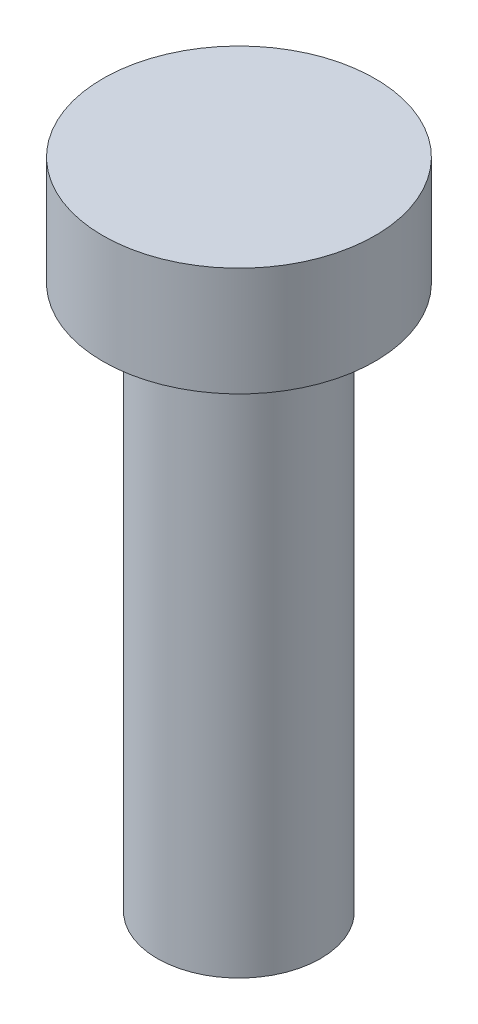
ISO-10303-21;
HEADER;
FILE_DESCRIPTION(('STEP AP214'),'2;1');
FILE_NAME('part.step','',(''),(''),'','','');
FILE_SCHEMA(('AUTOMOTIVE_DESIGN { 1 0 10303 214 1 1 1 1 }'));
ENDSEC;
DATA;
#1=APPLICATION_CONTEXT('core data for automotive mechanical design processes');
#2=APPLICATION_PROTOCOL_DEFINITION('international standard','automotive_design',2000,#1);
#3=PRODUCT_CONTEXT('',#1,'mechanical');
#4=PRODUCT('Part','Part','',(#3));
#5=PRODUCT_RELATED_PRODUCT_CATEGORY('part','',(#4));
#6=PRODUCT_DEFINITION_FORMATION('','',#4);
#7=PRODUCT_DEFINITION_CONTEXT('part definition',#1,'design');
#8=PRODUCT_DEFINITION('design','',#6,#7);
#9=PRODUCT_DEFINITION_SHAPE('','',#8);
#10=(LENGTH_UNIT() NAMED_UNIT(*) SI_UNIT(.MILLI.,.METRE.));
#11=(NAMED_UNIT(*) PLANE_ANGLE_UNIT() SI_UNIT($,.RADIAN.));
#12=(NAMED_UNIT(*) SI_UNIT($,.STERADIAN.) SOLID_ANGLE_UNIT());
#13=UNCERTAINTY_MEASURE_WITH_UNIT(LENGTH_MEASURE(1.E-05),#10,'distance_accuracy_value','');
#14=(GEOMETRIC_REPRESENTATION_CONTEXT(3) GLOBAL_UNCERTAINTY_ASSIGNED_CONTEXT((#13)) GLOBAL_UNIT_ASSIGNED_CONTEXT((#10,
#11,#12)) REPRESENTATION_CONTEXT('',''));
#15=CARTESIAN_POINT('',(0.,0.,0.));
#16=DIRECTION('',(0.,0.,1.));
#17=DIRECTION('',(1.,0.,0.));
#18=AXIS2_PLACEMENT_3D('',#15,#16,#17);
#19=CARTESIAN_POINT('',(0.,2.,0.));
#20=DIRECTION('',(0.,-1.,0.));
#21=DIRECTION('',(0.,0.,-1.));
#22=AXIS2_PLACEMENT_3D('',#19,#20,#21);
#23=CYLINDRICAL_SURFACE('',#22,2.5);
#24=CARTESIAN_POINT('',(0.,2.,0.));
#25=DIRECTION('',(0.,1.,0.));
#26=DIRECTION('',(0.,0.,1.));
#27=AXIS2_PLACEMENT_3D('',#24,#25,#26);
#28=CIRCLE('',#27,2.5);
#29=CARTESIAN_POINT('',(0.,2.,2.5));
#30=VERTEX_POINT('',#29);
#31=EDGE_CURVE('E10',#30,#30,#28,.T.);
#32=ORIENTED_EDGE('',*,*,#31,.F.);
#33=EDGE_LOOP('',(#32));
#34=FACE_BOUND('',#33,.T.);
#35=CARTESIAN_POINT('',(0.,0.,0.));
#36=DIRECTION('',(0.,1.,0.));
#37=DIRECTION('',(0.,0.,1.));
#38=AXIS2_PLACEMENT_3D('',#35,#36,#37);
#39=CIRCLE('',#38,2.5);
#40=CARTESIAN_POINT('',(0.,0.,2.5));
#41=VERTEX_POINT('',#40);
#42=EDGE_CURVE('E37',#41,#41,#39,.T.);
#43=ORIENTED_EDGE('',*,*,#42,.T.);
#44=EDGE_LOOP('',(#43));
#45=FACE_BOUND('',#44,.T.);
#46=ADVANCED_FACE('F34',(#34,#45),#23,.T.);
#47=CARTESIAN_POINT('',(0.,2.,0.));
#48=DIRECTION('',(0.,1.,0.));
#49=DIRECTION('',(0.,0.,1.));
#50=AXIS2_PLACEMENT_3D('',#47,#48,#49);
#51=PLANE('',#50);
#52=ORIENTED_EDGE('',*,*,#31,.T.);
#53=EDGE_LOOP('',(#52));
#54=FACE_BOUND('',#53,.T.);
#55=ADVANCED_FACE('F64',(#54),#51,.T.);
#56=CARTESIAN_POINT('',(0.,0.,0.));
#57=DIRECTION('',(0.,1.,0.));
#58=DIRECTION('',(0.,0.,1.));
#59=AXIS2_PLACEMENT_3D('',#56,#57,#58);
#60=PLANE('',#59);
#61=CARTESIAN_POINT('',(0.,0.,0.));
#62=DIRECTION('',(0.,1.,0.));
#63=DIRECTION('',(0.,0.,1.));
#64=AXIS2_PLACEMENT_3D('',#61,#62,#63);
#65=CIRCLE('',#64,1.5);
#66=CARTESIAN_POINT('',(0.,0.,1.5));
#67=VERTEX_POINT('',#66);
#68=EDGE_CURVE('E46',#67,#67,#65,.T.);
#69=ORIENTED_EDGE('',*,*,#68,.T.);
#70=EDGE_LOOP('',(#69));
#71=FACE_BOUND('',#70,.T.);
#72=ORIENTED_EDGE('',*,*,#42,.F.);
#73=EDGE_LOOP('',(#72));
#74=FACE_BOUND('',#73,.T.);
#75=ADVANCED_FACE('F61',(#71,#74),#60,.F.);
#76=CARTESIAN_POINT('',(0.,-10.,0.));
#77=DIRECTION('',(0.,1.,0.));
#78=DIRECTION('',(0.,0.,1.));
#79=AXIS2_PLACEMENT_3D('',#76,#77,#78);
#80=CYLINDRICAL_SURFACE('',#79,1.5);
#81=CARTESIAN_POINT('',(0.,-10.,0.));
#82=DIRECTION('',(0.,1.,0.));
#83=DIRECTION('',(0.,0.,1.));
#84=AXIS2_PLACEMENT_3D('',#81,#82,#83);
#85=CIRCLE('',#84,1.5);
#86=CARTESIAN_POINT('',(0.,-10.,1.5));
#87=VERTEX_POINT('',#86);
#88=EDGE_CURVE('E44',#87,#87,#85,.T.);
#89=ORIENTED_EDGE('',*,*,#88,.T.);
#90=EDGE_LOOP('',(#89));
#91=FACE_BOUND('',#90,.T.);
#92=ORIENTED_EDGE('',*,*,#68,.F.);
#93=EDGE_LOOP('',(#92));
#94=FACE_BOUND('',#93,.T.);
#95=ADVANCED_FACE('F52',(#91,#94),#80,.T.);
#96=CARTESIAN_POINT('',(0.,-10.,0.));
#97=DIRECTION('',(0.,1.,0.));
#98=DIRECTION('',(0.,0.,1.));
#99=AXIS2_PLACEMENT_3D('',#96,#97,#98);
#100=PLANE('',#99);
#101=ORIENTED_EDGE('',*,*,#88,.F.);
#102=EDGE_LOOP('',(#101));
#103=FACE_BOUND('',#102,.T.);
#104=ADVANCED_FACE('F55',(#103),#100,.F.);
#105=CLOSED_SHELL('',(#46,#55,#75,#95,#104));
#106=MANIFOLD_SOLID_BREP('B2',#105);
#107=ADVANCED_BREP_SHAPE_REPRESENTATION('',(#18,#106),#14);
#108=SHAPE_DEFINITION_REPRESENTATION(#9,#107);
ENDSEC;
END-ISO-10303-21;
